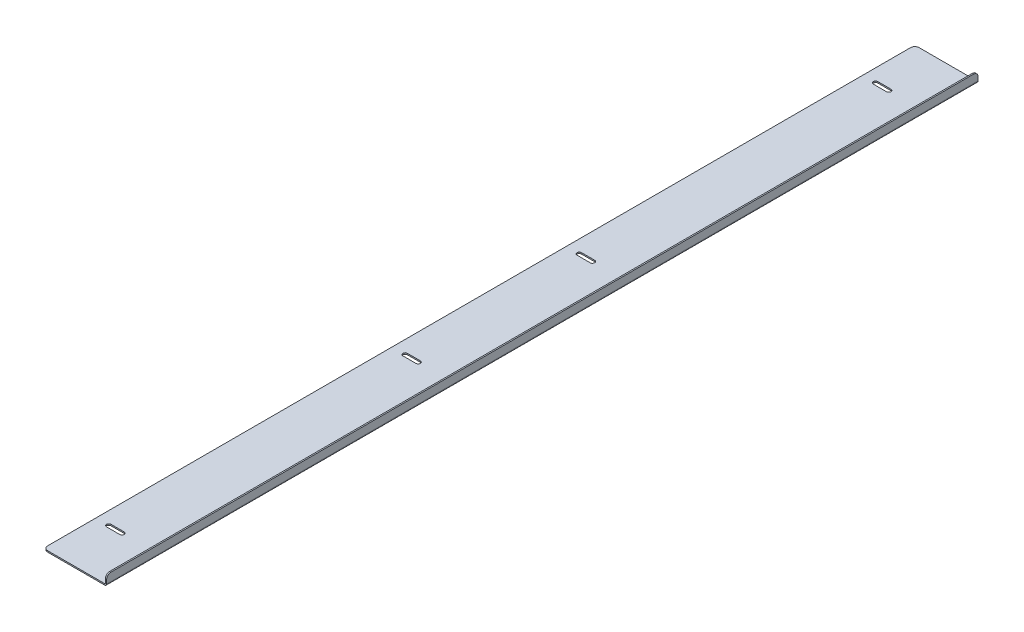
ISO-10303-21;
HEADER;
FILE_DESCRIPTION(('STEP AP214'),'2;1');
FILE_NAME('part.step','',(''),(''),'','','');
FILE_SCHEMA(('AUTOMOTIVE_DESIGN { 1 0 10303 214 1 1 1 1 }'));
ENDSEC;
DATA;
#1=APPLICATION_CONTEXT('core data for automotive mechanical design processes');
#2=APPLICATION_PROTOCOL_DEFINITION('international standard','automotive_design',2000,#1);
#3=PRODUCT_CONTEXT('',#1,'mechanical');
#4=PRODUCT('Part','Part','',(#3));
#5=PRODUCT_RELATED_PRODUCT_CATEGORY('part','',(#4));
#6=PRODUCT_DEFINITION_FORMATION('','',#4);
#7=PRODUCT_DEFINITION_CONTEXT('part definition',#1,'design');
#8=PRODUCT_DEFINITION('design','',#6,#7);
#9=PRODUCT_DEFINITION_SHAPE('','',#8);
#10=(LENGTH_UNIT() NAMED_UNIT(*) SI_UNIT(.MILLI.,.METRE.));
#11=(NAMED_UNIT(*) PLANE_ANGLE_UNIT() SI_UNIT($,.RADIAN.));
#12=(NAMED_UNIT(*) SI_UNIT($,.STERADIAN.) SOLID_ANGLE_UNIT());
#13=UNCERTAINTY_MEASURE_WITH_UNIT(LENGTH_MEASURE(1.E-05),#10,'distance_accuracy_value','');
#14=(GEOMETRIC_REPRESENTATION_CONTEXT(3) GLOBAL_UNCERTAINTY_ASSIGNED_CONTEXT((#13)) GLOBAL_UNIT_ASSIGNED_CONTEXT((#10,
#11,#12)) REPRESENTATION_CONTEXT('',''));
#15=CARTESIAN_POINT('',(0.,0.,0.));
#16=DIRECTION('',(0.,0.,1.));
#17=DIRECTION('',(1.,0.,0.));
#18=AXIS2_PLACEMENT_3D('',#15,#16,#17);
#19=CARTESIAN_POINT('',(-35.5,-5.,1000.));
#20=DIRECTION('',(0.,1.,0.));
#21=DIRECTION('',(0.,0.,1.));
#22=AXIS2_PLACEMENT_3D('',#19,#20,#21);
#23=PLANE('',#22);
#24=DIRECTION('',(1.,0.,0.));
#25=VECTOR('',#24,1.);
#26=CARTESIAN_POINT('',(0.,-5.,937.45));
#27=LINE('',#26,#25);
#28=CARTESIAN_POINT('',(-20.4999999999997,-5.,937.45));
#29=VERTEX_POINT('',#28);
#30=CARTESIAN_POINT('',(-5.49999999999965,-5.,937.45));
#31=VERTEX_POINT('',#30);
#32=EDGE_CURVE('E279',#29,#31,#27,.T.);
#33=ORIENTED_EDGE('',*,*,#32,.T.);
#34=CARTESIAN_POINT('',(-5.49999999999965,-5.,940.));
#35=DIRECTION('',(0.,1.,0.));
#36=DIRECTION('',(0.,0.,1.));
#37=AXIS2_PLACEMENT_3D('',#34,#35,#36);
#38=CIRCLE('',#37,2.55000000000005);
#39=CARTESIAN_POINT('',(-5.49999999999965,-5.,942.55));
#40=VERTEX_POINT('',#39);
#41=EDGE_CURVE('E261',#31,#40,#38,.F.);
#42=ORIENTED_EDGE('',*,*,#41,.T.);
#43=DIRECTION('',(1.,0.,0.));
#44=VECTOR('',#43,1.);
#45=CARTESIAN_POINT('',(0.,-5.,942.55));
#46=LINE('',#45,#44);
#47=CARTESIAN_POINT('',(-20.4999999999997,-5.,942.55));
#48=VERTEX_POINT('',#47);
#49=EDGE_CURVE('E268',#48,#40,#46,.T.);
#50=ORIENTED_EDGE('',*,*,#49,.F.);
#51=CARTESIAN_POINT('',(-20.4999999999997,-5.,940.));
#52=DIRECTION('',(0.,1.,0.));
#53=DIRECTION('',(0.,0.,1.));
#54=AXIS2_PLACEMENT_3D('',#51,#52,#53);
#55=CIRCLE('',#54,2.55000000000005);
#56=EDGE_CURVE('E282',#29,#48,#55,.T.);
#57=ORIENTED_EDGE('',*,*,#56,.F.);
#58=EDGE_LOOP('',(#33,#42,#50,#57));
#59=FACE_BOUND('',#58,.T.);
#60=DIRECTION('',(1.,0.,0.));
#61=VECTOR('',#60,1.);
#62=CARTESIAN_POINT('',(0.,-5.,62.5500000000001));
#63=LINE('',#62,#61);
#64=CARTESIAN_POINT('',(-20.4999999999998,-5.,62.5500000000001));
#65=VERTEX_POINT('',#64);
#66=CARTESIAN_POINT('',(-5.49999999999977,-5.,62.5500000000001));
#67=VERTEX_POINT('',#66);
#68=EDGE_CURVE('E342',#65,#67,#63,.T.);
#69=ORIENTED_EDGE('',*,*,#68,.F.);
#70=CARTESIAN_POINT('',(-20.4999999999998,-5.,60.0000000000001));
#71=DIRECTION('',(0.,1.,0.));
#72=DIRECTION('',(0.,0.,1.));
#73=AXIS2_PLACEMENT_3D('',#70,#71,#72);
#74=CIRCLE('',#73,2.55000000000005);
#75=CARTESIAN_POINT('',(-20.4999999999998,-5.,57.45));
#76=VERTEX_POINT('',#75);
#77=EDGE_CURVE('E321',#65,#76,#74,.F.);
#78=ORIENTED_EDGE('',*,*,#77,.T.);
#79=DIRECTION('',(1.,0.,0.));
#80=VECTOR('',#79,1.);
#81=CARTESIAN_POINT('',(0.,-5.,57.45));
#82=LINE('',#81,#80);
#83=CARTESIAN_POINT('',(-5.49999999999977,-5.,57.45));
#84=VERTEX_POINT('',#83);
#85=EDGE_CURVE('E331',#76,#84,#82,.T.);
#86=ORIENTED_EDGE('',*,*,#85,.T.);
#87=CARTESIAN_POINT('',(-5.49999999999977,-5.,60.0000000000001));
#88=DIRECTION('',(0.,1.,0.));
#89=DIRECTION('',(0.,0.,1.));
#90=AXIS2_PLACEMENT_3D('',#87,#88,#89);
#91=CIRCLE('',#90,2.55000000000005);
#92=EDGE_CURVE('E345',#67,#84,#91,.T.);
#93=ORIENTED_EDGE('',*,*,#92,.F.);
#94=EDGE_LOOP('',(#69,#78,#86,#93));
#95=FACE_BOUND('',#94,.T.);
#96=DIRECTION('',(0.,0.,-1.));
#97=VECTOR('',#96,1.);
#98=CARTESIAN_POINT('',(-35.5,-5.,1000.));
#99=LINE('',#98,#97);
#100=CARTESIAN_POINT('',(-35.5,-5.,995.));
#101=VERTEX_POINT('',#100);
#102=CARTESIAN_POINT('',(-35.5,-5.,5.));
#103=VERTEX_POINT('',#102);
#104=EDGE_CURVE('E399',#101,#103,#99,.T.);
#105=ORIENTED_EDGE('',*,*,#104,.F.);
#106=CARTESIAN_POINT('',(-30.5,-5.,995.));
#107=DIRECTION('',(0.,1.,0.));
#108=DIRECTION('',(0.,0.,1.));
#109=AXIS2_PLACEMENT_3D('',#106,#107,#108);
#110=CIRCLE('',#109,5.);
#111=CARTESIAN_POINT('',(-30.5,-5.,1000.));
#112=VERTEX_POINT('',#111);
#113=EDGE_CURVE('E446',#101,#112,#110,.T.);
#114=ORIENTED_EDGE('',*,*,#113,.T.);
#115=DIRECTION('',(1.,0.,0.));
#116=VECTOR('',#115,1.);
#117=CARTESIAN_POINT('',(-35.5,-5.,1000.));
#118=LINE('',#117,#116);
#119=CARTESIAN_POINT('',(34.7634,-5.,1000.));
#120=VERTEX_POINT('',#119);
#121=EDGE_CURVE('E370',#112,#120,#118,.T.);
#122=ORIENTED_EDGE('',*,*,#121,.T.);
#123=DIRECTION('',(0.,0.,-1.));
#124=VECTOR('',#123,1.);
#125=CARTESIAN_POINT('',(34.7634,-5.,1000.));
#126=LINE('',#125,#124);
#127=CARTESIAN_POINT('',(34.7634,-5.,0.));
#128=VERTEX_POINT('',#127);
#129=EDGE_CURVE('E402',#120,#128,#126,.T.);
#130=ORIENTED_EDGE('',*,*,#129,.T.);
#131=DIRECTION('',(1.,0.,0.));
#132=VECTOR('',#131,1.);
#133=CARTESIAN_POINT('',(-35.5,-5.,0.));
#134=LINE('',#133,#132);
#135=CARTESIAN_POINT('',(-30.5,-5.,0.));
#136=VERTEX_POINT('',#135);
#137=EDGE_CURVE('E386',#136,#128,#134,.T.);
#138=ORIENTED_EDGE('',*,*,#137,.F.);
#139=CARTESIAN_POINT('',(-30.5,-5.,5.));
#140=DIRECTION('',(0.,1.,0.));
#141=DIRECTION('',(0.,0.,1.));
#142=AXIS2_PLACEMENT_3D('',#139,#140,#141);
#143=CIRCLE('',#142,5.);
#144=EDGE_CURVE('E444',#136,#103,#143,.T.);
#145=ORIENTED_EDGE('',*,*,#144,.T.);
#146=EDGE_LOOP('',(#105,#114,#122,#130,#138,#145));
#147=FACE_BOUND('',#146,.T.);
#148=DIRECTION('',(1.,0.,0.));
#149=VECTOR('',#148,1.);
#150=CARTESIAN_POINT('',(0.,-5.,602.55));
#151=LINE('',#150,#149);
#152=CARTESIAN_POINT('',(-20.4999999999998,-5.,602.55));
#153=VERTEX_POINT('',#152);
#154=CARTESIAN_POINT('',(-5.49999999999978,-5.,602.55));
#155=VERTEX_POINT('',#154);
#156=EDGE_CURVE('E310',#153,#155,#151,.T.);
#157=ORIENTED_EDGE('',*,*,#156,.F.);
#158=CARTESIAN_POINT('',(-20.4999999999998,-5.,600.));
#159=DIRECTION('',(0.,1.,0.));
#160=DIRECTION('',(0.,0.,1.));
#161=AXIS2_PLACEMENT_3D('',#158,#159,#160);
#162=CIRCLE('',#161,2.54999999999983);
#163=CARTESIAN_POINT('',(-20.4999999999998,-5.,597.450000000001));
#164=VERTEX_POINT('',#163);
#165=EDGE_CURVE('E289',#153,#164,#162,.F.);
#166=ORIENTED_EDGE('',*,*,#165,.T.);
#167=DIRECTION('',(1.,0.,0.));
#168=VECTOR('',#167,1.);
#169=CARTESIAN_POINT('',(0.,-5.,597.450000000001));
#170=LINE('',#169,#168);
#171=CARTESIAN_POINT('',(-5.49999999999978,-5.,597.450000000001));
#172=VERTEX_POINT('',#171);
#173=EDGE_CURVE('E299',#164,#172,#170,.T.);
#174=ORIENTED_EDGE('',*,*,#173,.T.);
#175=CARTESIAN_POINT('',(-5.49999999999978,-5.,600.));
#176=DIRECTION('',(0.,1.,0.));
#177=DIRECTION('',(0.,0.,1.));
#178=AXIS2_PLACEMENT_3D('',#175,#176,#177);
#179=CIRCLE('',#178,2.54999999999983);
#180=EDGE_CURVE('E313',#155,#172,#179,.T.);
#181=ORIENTED_EDGE('',*,*,#180,.F.);
#182=EDGE_LOOP('',(#157,#166,#174,#181));
#183=FACE_BOUND('',#182,.T.);
#184=DIRECTION('',(1.,0.,0.));
#185=VECTOR('',#184,1.);
#186=CARTESIAN_POINT('',(0.,-5.,397.45));
#187=LINE('',#186,#185);
#188=CARTESIAN_POINT('',(-20.4999999999997,-5.,397.45));
#189=VERTEX_POINT('',#188);
#190=CARTESIAN_POINT('',(-5.49999999999967,-5.,397.45));
#191=VERTEX_POINT('',#190);
#192=EDGE_CURVE('E255',#189,#191,#187,.T.);
#193=ORIENTED_EDGE('',*,*,#192,.T.);
#194=CARTESIAN_POINT('',(-5.49999999999966,-5.,400.));
#195=DIRECTION('',(0.,1.,0.));
#196=DIRECTION('',(0.,0.,1.));
#197=AXIS2_PLACEMENT_3D('',#194,#195,#196);
#198=CIRCLE('',#197,2.54999999999994);
#199=CARTESIAN_POINT('',(-5.49999999999966,-5.,402.55));
#200=VERTEX_POINT('',#199);
#201=EDGE_CURVE('E240',#191,#200,#198,.F.);
#202=ORIENTED_EDGE('',*,*,#201,.T.);
#203=DIRECTION('',(1.,0.,0.));
#204=VECTOR('',#203,1.);
#205=CARTESIAN_POINT('',(0.,-5.,402.55));
#206=LINE('',#205,#204);
#207=CARTESIAN_POINT('',(-20.4999999999997,-5.,402.55));
#208=VERTEX_POINT('',#207);
#209=EDGE_CURVE('E246',#208,#200,#206,.T.);
#210=ORIENTED_EDGE('',*,*,#209,.F.);
#211=CARTESIAN_POINT('',(-20.4999999999997,-5.,400.));
#212=DIRECTION('',(0.,1.,0.));
#213=DIRECTION('',(0.,0.,1.));
#214=AXIS2_PLACEMENT_3D('',#211,#212,#213);
#215=CIRCLE('',#214,2.54999999999994);
#216=EDGE_CURVE('E249',#189,#208,#215,.T.);
#217=ORIENTED_EDGE('',*,*,#216,.F.);
#218=EDGE_LOOP('',(#193,#202,#210,#217));
#219=FACE_BOUND('',#218,.T.);
#220=ADVANCED_FACE('F35',(#59,#95,#147,#183,#219),#23,.T.);
#221=CARTESIAN_POINT('',(-35.5,-6.5,1000.));
#222=DIRECTION('',(0.,1.,0.));
#223=DIRECTION('',(0.,0.,1.));
#224=AXIS2_PLACEMENT_3D('',#221,#222,#223);
#225=PLANE('',#224);
#226=CARTESIAN_POINT('',(-5.49999999999965,-6.5,940.));
#227=DIRECTION('',(0.,1.,0.));
#228=DIRECTION('',(0.,0.,1.));
#229=AXIS2_PLACEMENT_3D('',#226,#227,#228);
#230=CIRCLE('',#229,2.55000000000005);
#231=CARTESIAN_POINT('',(-5.49999999999965,-6.5,937.45));
#232=VERTEX_POINT('',#231);
#233=CARTESIAN_POINT('',(-5.49999999999965,-6.5,942.55));
#234=VERTEX_POINT('',#233);
#235=EDGE_CURVE('E265',#232,#234,#230,.F.);
#236=ORIENTED_EDGE('',*,*,#235,.F.);
#237=DIRECTION('',(1.,0.,0.));
#238=VECTOR('',#237,1.);
#239=CARTESIAN_POINT('',(0.,-6.5,937.45));
#240=LINE('',#239,#238);
#241=CARTESIAN_POINT('',(-20.4999999999997,-6.5,937.45));
#242=VERTEX_POINT('',#241);
#243=EDGE_CURVE('E267',#242,#232,#240,.T.);
#244=ORIENTED_EDGE('',*,*,#243,.F.);
#245=CARTESIAN_POINT('',(-20.4999999999997,-6.5,940.));
#246=DIRECTION('',(0.,1.,0.));
#247=DIRECTION('',(0.,0.,1.));
#248=AXIS2_PLACEMENT_3D('',#245,#246,#247);
#249=CIRCLE('',#248,2.55000000000005);
#250=CARTESIAN_POINT('',(-20.4999999999997,-6.5,942.55));
#251=VERTEX_POINT('',#250);
#252=EDGE_CURVE('E270',#242,#251,#249,.T.);
#253=ORIENTED_EDGE('',*,*,#252,.T.);
#254=DIRECTION('',(1.,0.,0.));
#255=VECTOR('',#254,1.);
#256=CARTESIAN_POINT('',(0.,-6.5,942.55));
#257=LINE('',#256,#255);
#258=EDGE_CURVE('E273',#251,#234,#257,.T.);
#259=ORIENTED_EDGE('',*,*,#258,.T.);
#260=EDGE_LOOP('',(#236,#244,#253,#259));
#261=FACE_BOUND('',#260,.T.);
#262=CARTESIAN_POINT('',(-20.4999999999998,-6.5,60.0000000000001));
#263=DIRECTION('',(0.,1.,0.));
#264=DIRECTION('',(0.,0.,1.));
#265=AXIS2_PLACEMENT_3D('',#262,#263,#264);
#266=CIRCLE('',#265,2.55000000000005);
#267=CARTESIAN_POINT('',(-20.4999999999998,-6.5,62.5500000000001));
#268=VERTEX_POINT('',#267);
#269=CARTESIAN_POINT('',(-20.4999999999998,-6.5,57.45));
#270=VERTEX_POINT('',#269);
#271=EDGE_CURVE('E328',#268,#270,#266,.F.);
#272=ORIENTED_EDGE('',*,*,#271,.F.);
#273=DIRECTION('',(1.,0.,0.));
#274=VECTOR('',#273,1.);
#275=CARTESIAN_POINT('',(0.,-6.5,62.5500000000001));
#276=LINE('',#275,#274);
#277=CARTESIAN_POINT('',(-5.49999999999978,-6.5,62.5500000000001));
#278=VERTEX_POINT('',#277);
#279=EDGE_CURVE('E330',#268,#278,#276,.T.);
#280=ORIENTED_EDGE('',*,*,#279,.T.);
#281=CARTESIAN_POINT('',(-5.49999999999977,-6.5,60.0000000000001));
#282=DIRECTION('',(0.,1.,0.));
#283=DIRECTION('',(0.,0.,1.));
#284=AXIS2_PLACEMENT_3D('',#281,#282,#283);
#285=CIRCLE('',#284,2.55000000000005);
#286=CARTESIAN_POINT('',(-5.49999999999977,-6.5,57.45));
#287=VERTEX_POINT('',#286);
#288=EDGE_CURVE('E334',#278,#287,#285,.T.);
#289=ORIENTED_EDGE('',*,*,#288,.T.);
#290=DIRECTION('',(1.,0.,0.));
#291=VECTOR('',#290,1.);
#292=CARTESIAN_POINT('',(0.,-6.5,57.45));
#293=LINE('',#292,#291);
#294=EDGE_CURVE('E337',#270,#287,#293,.T.);
#295=ORIENTED_EDGE('',*,*,#294,.F.);
#296=EDGE_LOOP('',(#272,#280,#289,#295));
#297=FACE_BOUND('',#296,.T.);
#298=DIRECTION('',(1.,0.,0.));
#299=VECTOR('',#298,1.);
#300=CARTESIAN_POINT('',(-35.5,-6.5,1000.));
#301=LINE('',#300,#299);
#302=CARTESIAN_POINT('',(-30.5,-6.5,1000.));
#303=VERTEX_POINT('',#302);
#304=CARTESIAN_POINT('',(34.7634,-6.5,1000.));
#305=VERTEX_POINT('',#304);
#306=EDGE_CURVE('E372',#303,#305,#301,.T.);
#307=ORIENTED_EDGE('',*,*,#306,.F.);
#308=CARTESIAN_POINT('',(-30.5,-6.5,995.));
#309=DIRECTION('',(0.,1.,0.));
#310=DIRECTION('',(0.,0.,1.));
#311=AXIS2_PLACEMENT_3D('',#308,#309,#310);
#312=CIRCLE('',#311,5.);
#313=CARTESIAN_POINT('',(-35.5,-6.5,995.));
#314=VERTEX_POINT('',#313);
#315=EDGE_CURVE('E450',#303,#314,#312,.F.);
#316=ORIENTED_EDGE('',*,*,#315,.T.);
#317=DIRECTION('',(0.,0.,-1.));
#318=VECTOR('',#317,1.);
#319=CARTESIAN_POINT('',(-35.5,-6.5,1000.));
#320=LINE('',#319,#318);
#321=CARTESIAN_POINT('',(-35.5,-6.5,5.));
#322=VERTEX_POINT('',#321);
#323=EDGE_CURVE('E397',#314,#322,#320,.T.);
#324=ORIENTED_EDGE('',*,*,#323,.T.);
#325=CARTESIAN_POINT('',(-30.5,-6.5,5.));
#326=DIRECTION('',(0.,1.,0.));
#327=DIRECTION('',(0.,0.,1.));
#328=AXIS2_PLACEMENT_3D('',#325,#326,#327);
#329=CIRCLE('',#328,5.);
#330=CARTESIAN_POINT('',(-30.5,-6.5,0.));
#331=VERTEX_POINT('',#330);
#332=EDGE_CURVE('E50',#322,#331,#329,.F.);
#333=ORIENTED_EDGE('',*,*,#332,.T.);
#334=DIRECTION('',(1.,0.,0.));
#335=VECTOR('',#334,1.);
#336=CARTESIAN_POINT('',(-35.5,-6.5,0.));
#337=LINE('',#336,#335);
#338=CARTESIAN_POINT('',(34.7634,-6.5,0.));
#339=VERTEX_POINT('',#338);
#340=EDGE_CURVE('E388',#331,#339,#337,.T.);
#341=ORIENTED_EDGE('',*,*,#340,.T.);
#342=DIRECTION('',(0.,0.,-1.));
#343=VECTOR('',#342,1.);
#344=CARTESIAN_POINT('',(34.7634,-6.5,1000.));
#345=LINE('',#344,#343);
#346=EDGE_CURVE('E394',#305,#339,#345,.T.);
#347=ORIENTED_EDGE('',*,*,#346,.F.);
#348=EDGE_LOOP('',(#307,#316,#324,#333,#341,#347));
#349=FACE_BOUND('',#348,.T.);
#350=CARTESIAN_POINT('',(-20.4999999999998,-6.5,600.));
#351=DIRECTION('',(0.,1.,0.));
#352=DIRECTION('',(0.,0.,1.));
#353=AXIS2_PLACEMENT_3D('',#350,#351,#352);
#354=CIRCLE('',#353,2.54999999999983);
#355=CARTESIAN_POINT('',(-20.4999999999998,-6.5,602.55));
#356=VERTEX_POINT('',#355);
#357=CARTESIAN_POINT('',(-20.4999999999998,-6.5,597.450000000001));
#358=VERTEX_POINT('',#357);
#359=EDGE_CURVE('E296',#356,#358,#354,.F.);
#360=ORIENTED_EDGE('',*,*,#359,.F.);
#361=DIRECTION('',(1.,0.,0.));
#362=VECTOR('',#361,1.);
#363=CARTESIAN_POINT('',(0.,-6.5,602.55));
#364=LINE('',#363,#362);
#365=CARTESIAN_POINT('',(-5.49999999999978,-6.5,602.55));
#366=VERTEX_POINT('',#365);
#367=EDGE_CURVE('E298',#356,#366,#364,.T.);
#368=ORIENTED_EDGE('',*,*,#367,.T.);
#369=CARTESIAN_POINT('',(-5.49999999999978,-6.5,600.));
#370=DIRECTION('',(0.,1.,0.));
#371=DIRECTION('',(0.,0.,1.));
#372=AXIS2_PLACEMENT_3D('',#369,#370,#371);
#373=CIRCLE('',#372,2.54999999999983);
#374=CARTESIAN_POINT('',(-5.49999999999978,-6.5,597.450000000001));
#375=VERTEX_POINT('',#374);
#376=EDGE_CURVE('E302',#366,#375,#373,.T.);
#377=ORIENTED_EDGE('',*,*,#376,.T.);
#378=DIRECTION('',(1.,0.,0.));
#379=VECTOR('',#378,1.);
#380=CARTESIAN_POINT('',(0.,-6.5,597.450000000001));
#381=LINE('',#380,#379);
#382=EDGE_CURVE('E305',#358,#375,#381,.T.);
#383=ORIENTED_EDGE('',*,*,#382,.F.);
#384=EDGE_LOOP('',(#360,#368,#377,#383));
#385=FACE_BOUND('',#384,.T.);
#386=CARTESIAN_POINT('',(-5.49999999999966,-6.5,400.));
#387=DIRECTION('',(0.,1.,0.));
#388=DIRECTION('',(0.,0.,1.));
#389=AXIS2_PLACEMENT_3D('',#386,#387,#388);
#390=CIRCLE('',#389,2.54999999999994);
#391=CARTESIAN_POINT('',(-5.49999999999966,-6.5,397.45));
#392=VERTEX_POINT('',#391);
#393=CARTESIAN_POINT('',(-5.49999999999966,-6.5,402.55));
#394=VERTEX_POINT('',#393);
#395=EDGE_CURVE('E234',#392,#394,#390,.F.);
#396=ORIENTED_EDGE('',*,*,#395,.F.);
#397=DIRECTION('',(1.,0.,0.));
#398=VECTOR('',#397,1.);
#399=CARTESIAN_POINT('',(0.,-6.5,397.45));
#400=LINE('',#399,#398);
#401=CARTESIAN_POINT('',(-20.4999999999997,-6.5,397.45));
#402=VERTEX_POINT('',#401);
#403=EDGE_CURVE('E223',#402,#392,#400,.T.);
#404=ORIENTED_EDGE('',*,*,#403,.F.);
#405=CARTESIAN_POINT('',(-20.4999999999997,-6.5,400.));
#406=DIRECTION('',(0.,1.,0.));
#407=DIRECTION('',(0.,0.,1.));
#408=AXIS2_PLACEMENT_3D('',#405,#406,#407);
#409=CIRCLE('',#408,2.54999999999994);
#410=CARTESIAN_POINT('',(-20.4999999999997,-6.5,402.55));
#411=VERTEX_POINT('',#410);
#412=EDGE_CURVE('E233',#402,#411,#409,.T.);
#413=ORIENTED_EDGE('',*,*,#412,.T.);
#414=DIRECTION('',(1.,0.,0.));
#415=VECTOR('',#414,1.);
#416=CARTESIAN_POINT('',(0.,-6.5,402.55));
#417=LINE('',#416,#415);
#418=EDGE_CURVE('E241',#411,#394,#417,.T.);
#419=ORIENTED_EDGE('',*,*,#418,.T.);
#420=EDGE_LOOP('',(#396,#404,#413,#419));
#421=FACE_BOUND('',#420,.T.);
#422=ADVANCED_FACE('F244',(#261,#297,#349,#385,#421),#225,.F.);
#423=CARTESIAN_POINT('',(35.5,-4.2634,1000.));
#424=DIRECTION('',(0.,0.,1.));
#425=DIRECTION('',(1.,0.,0.));
#426=AXIS2_PLACEMENT_3D('',#423,#424,#425);
#427=PLANE('',#426);
#428=DIRECTION('',(1.,0.,0.));
#429=VECTOR('',#428,1.);
#430=CARTESIAN_POINT('',(35.5,-4.2634,1000.));
#431=LINE('',#430,#429);
#432=CARTESIAN_POINT('',(35.5,-4.2634,1000.));
#433=VERTEX_POINT('',#432);
#434=CARTESIAN_POINT('',(37.,-4.2634,1000.));
#435=VERTEX_POINT('',#434);
#436=EDGE_CURVE('E422',#433,#435,#431,.T.);
#437=ORIENTED_EDGE('',*,*,#436,.F.);
#438=CARTESIAN_POINT('',(34.7634,-4.2634,1000.));
#439=DIRECTION('',(0.,0.,1.));
#440=DIRECTION('',(1.,0.,0.));
#441=AXIS2_PLACEMENT_3D('',#438,#439,#440);
#442=CIRCLE('',#441,0.7366);
#443=EDGE_CURVE('E367',#120,#433,#442,.T.);
#444=ORIENTED_EDGE('',*,*,#443,.F.);
#445=DIRECTION('',(0.,1.,0.));
#446=VECTOR('',#445,1.);
#447=CARTESIAN_POINT('',(34.7634,-6.5,1000.));
#448=LINE('',#447,#446);
#449=EDGE_CURVE('E419',#305,#120,#448,.T.);
#450=ORIENTED_EDGE('',*,*,#449,.F.);
#451=CARTESIAN_POINT('',(34.7634,-4.2634,1000.));
#452=DIRECTION('',(0.,0.,1.));
#453=DIRECTION('',(1.,0.,0.));
#454=AXIS2_PLACEMENT_3D('',#451,#452,#453);
#455=CIRCLE('',#454,2.2366);
#456=EDGE_CURVE('E374',#305,#435,#455,.T.);
#457=ORIENTED_EDGE('',*,*,#456,.T.);
#458=EDGE_LOOP('',(#437,#444,#450,#457));
#459=FACE_BOUND('',#458,.T.);
#460=ADVANCED_FACE('F511',(#459),#427,.T.);
#461=CARTESIAN_POINT('',(34.7634,-6.5,1000.));
#462=DIRECTION('',(0.,0.,1.));
#463=DIRECTION('',(1.,0.,0.));
#464=AXIS2_PLACEMENT_3D('',#461,#462,#463);
#465=PLANE('',#464);
#466=DIRECTION('',(0.,1.,0.));
#467=VECTOR('',#466,1.);
#468=CARTESIAN_POINT('',(37.,-5.,1000.));
#469=LINE('',#468,#467);
#470=CARTESIAN_POINT('',(37.,0.,1000.));
#471=VERTEX_POINT('',#470);
#472=EDGE_CURVE('E360',#435,#471,#469,.T.);
#473=ORIENTED_EDGE('',*,*,#472,.T.);
#474=DIRECTION('',(1.,0.,0.));
#475=VECTOR('',#474,1.);
#476=CARTESIAN_POINT('',(34.7634,0.,1000.));
#477=LINE('',#476,#475);
#478=CARTESIAN_POINT('',(35.5,0.,1000.));
#479=VERTEX_POINT('',#478);
#480=EDGE_CURVE('E433',#471,#479,#477,.F.);
#481=ORIENTED_EDGE('',*,*,#480,.T.);
#482=DIRECTION('',(0.,1.,0.));
#483=VECTOR('',#482,1.);
#484=CARTESIAN_POINT('',(35.5,-5.,1000.));
#485=LINE('',#484,#483);
#486=EDGE_CURVE('E363',#433,#479,#485,.T.);
#487=ORIENTED_EDGE('',*,*,#486,.F.);
#488=ORIENTED_EDGE('',*,*,#436,.T.);
#489=EDGE_LOOP('',(#473,#481,#487,#488));
#490=FACE_BOUND('',#489,.T.);
#491=ADVANCED_FACE('F490',(#490),#465,.T.);
#492=CARTESIAN_POINT('',(34.7634,-5.,0.));
#493=DIRECTION('',(0.,0.,-1.));
#494=DIRECTION('',(-1.,0.,0.));
#495=AXIS2_PLACEMENT_3D('',#492,#493,#494);
#496=PLANE('',#495);
#497=DIRECTION('',(0.,-1.,0.));
#498=VECTOR('',#497,1.);
#499=CARTESIAN_POINT('',(34.7634,-5.,0.));
#500=LINE('',#499,#498);
#501=EDGE_CURVE('E416',#128,#339,#500,.T.);
#502=ORIENTED_EDGE('',*,*,#501,.F.);
#503=CARTESIAN_POINT('',(34.7634,-4.2634,0.));
#504=DIRECTION('',(0.,0.,1.));
#505=DIRECTION('',(1.,0.,0.));
#506=AXIS2_PLACEMENT_3D('',#503,#504,#505);
#507=CIRCLE('',#506,0.7366);
#508=CARTESIAN_POINT('',(35.5,-4.2634,0.));
#509=VERTEX_POINT('',#508);
#510=EDGE_CURVE('E383',#128,#509,#507,.T.);
#511=ORIENTED_EDGE('',*,*,#510,.T.);
#512=DIRECTION('',(-1.,0.,0.));
#513=VECTOR('',#512,1.);
#514=CARTESIAN_POINT('',(37.,-4.2634,0.));
#515=LINE('',#514,#513);
#516=CARTESIAN_POINT('',(37.,-4.2634,0.));
#517=VERTEX_POINT('',#516);
#518=EDGE_CURVE('E414',#517,#509,#515,.T.);
#519=ORIENTED_EDGE('',*,*,#518,.F.);
#520=CARTESIAN_POINT('',(34.7634,-4.2634,0.));
#521=DIRECTION('',(0.,0.,1.));
#522=DIRECTION('',(1.,0.,0.));
#523=AXIS2_PLACEMENT_3D('',#520,#521,#522);
#524=CIRCLE('',#523,2.2366);
#525=EDGE_CURVE('E364',#339,#517,#524,.T.);
#526=ORIENTED_EDGE('',*,*,#525,.F.);
#527=EDGE_LOOP('',(#502,#511,#519,#526));
#528=FACE_BOUND('',#527,.T.);
#529=ADVANCED_FACE('F471',(#528),#496,.T.);
#530=CARTESIAN_POINT('',(37.,-4.2634,0.));
#531=DIRECTION('',(0.,0.,-1.));
#532=DIRECTION('',(-1.,0.,0.));
#533=AXIS2_PLACEMENT_3D('',#530,#531,#532);
#534=PLANE('',#533);
#535=ORIENTED_EDGE('',*,*,#340,.F.);
#536=DIRECTION('',(0.,1.,0.));
#537=VECTOR('',#536,1.);
#538=CARTESIAN_POINT('',(-30.5,-4.2634,0.));
#539=LINE('',#538,#537);
#540=EDGE_CURVE('E11',#331,#136,#539,.T.);
#541=ORIENTED_EDGE('',*,*,#540,.T.);
#542=ORIENTED_EDGE('',*,*,#137,.T.);
#543=ORIENTED_EDGE('',*,*,#501,.T.);
#544=EDGE_LOOP('',(#535,#541,#542,#543));
#545=FACE_BOUND('',#544,.T.);
#546=ADVANCED_FACE('F526',(#545),#534,.T.);
#547=CARTESIAN_POINT('',(37.,-5.,1000.));
#548=DIRECTION('',(-1.,0.,0.));
#549=DIRECTION('',(0.,0.,1.));
#550=AXIS2_PLACEMENT_3D('',#547,#548,#549);
#551=PLANE('',#550);
#552=DIRECTION('',(0.,0.,-1.));
#553=VECTOR('',#552,1.);
#554=CARTESIAN_POINT('',(37.,5.,1000.));
#555=LINE('',#554,#553);
#556=CARTESIAN_POINT('',(37.,5.,995.));
#557=VERTEX_POINT('',#556);
#558=CARTESIAN_POINT('',(37.,5.,5.));
#559=VERTEX_POINT('',#558);
#560=EDGE_CURVE('E411',#557,#559,#555,.T.);
#561=ORIENTED_EDGE('',*,*,#560,.F.);
#562=CARTESIAN_POINT('',(37.,0.,995.));
#563=DIRECTION('',(-1.,0.,0.));
#564=DIRECTION('',(0.,0.,1.));
#565=AXIS2_PLACEMENT_3D('',#562,#563,#564);
#566=CIRCLE('',#565,5.);
#567=EDGE_CURVE('E431',#557,#471,#566,.F.);
#568=ORIENTED_EDGE('',*,*,#567,.T.);
#569=ORIENTED_EDGE('',*,*,#472,.F.);
#570=DIRECTION('',(0.,0.,-1.));
#571=VECTOR('',#570,1.);
#572=CARTESIAN_POINT('',(37.,-4.2634,1000.));
#573=LINE('',#572,#571);
#574=EDGE_CURVE('E377',#435,#517,#573,.T.);
#575=ORIENTED_EDGE('',*,*,#574,.T.);
#576=DIRECTION('',(0.,1.,0.));
#577=VECTOR('',#576,1.);
#578=CARTESIAN_POINT('',(37.,-5.,0.));
#579=LINE('',#578,#577);
#580=CARTESIAN_POINT('',(37.,0.,0.));
#581=VERTEX_POINT('',#580);
#582=EDGE_CURVE('E353',#517,#581,#579,.T.);
#583=ORIENTED_EDGE('',*,*,#582,.T.);
#584=CARTESIAN_POINT('',(37.,0.,5.));
#585=DIRECTION('',(-1.,0.,0.));
#586=DIRECTION('',(0.,0.,1.));
#587=AXIS2_PLACEMENT_3D('',#584,#585,#586);
#588=CIRCLE('',#587,5.);
#589=EDGE_CURVE('E429',#581,#559,#588,.F.);
#590=ORIENTED_EDGE('',*,*,#589,.T.);
#591=EDGE_LOOP('',(#561,#568,#569,#575,#583,#590));
#592=FACE_BOUND('',#591,.T.);
#593=ADVANCED_FACE('F461',(#592),#551,.F.);
#594=CARTESIAN_POINT('',(35.5,5.,1000.));
#595=DIRECTION('',(0.,1.,0.));
#596=DIRECTION('',(0.,0.,1.));
#597=AXIS2_PLACEMENT_3D('',#594,#595,#596);
#598=PLANE('',#597);
#599=DIRECTION('',(0.,0.,-1.));
#600=VECTOR('',#599,1.);
#601=CARTESIAN_POINT('',(35.5,5.,1000.));
#602=LINE('',#601,#600);
#603=CARTESIAN_POINT('',(35.5,5.,995.));
#604=VERTEX_POINT('',#603);
#605=CARTESIAN_POINT('',(35.5,5.,5.));
#606=VERTEX_POINT('',#605);
#607=EDGE_CURVE('E408',#604,#606,#602,.T.);
#608=ORIENTED_EDGE('',*,*,#607,.F.);
#609=DIRECTION('',(1.,0.,0.));
#610=VECTOR('',#609,1.);
#611=CARTESIAN_POINT('',(35.5,5.,995.));
#612=LINE('',#611,#610);
#613=EDGE_CURVE('E426',#604,#557,#612,.T.);
#614=ORIENTED_EDGE('',*,*,#613,.T.);
#615=ORIENTED_EDGE('',*,*,#560,.T.);
#616=DIRECTION('',(1.,0.,0.));
#617=VECTOR('',#616,1.);
#618=CARTESIAN_POINT('',(35.5,5.,5.));
#619=LINE('',#618,#617);
#620=EDGE_CURVE('E424',#559,#606,#619,.F.);
#621=ORIENTED_EDGE('',*,*,#620,.T.);
#622=EDGE_LOOP('',(#608,#614,#615,#621));
#623=FACE_BOUND('',#622,.T.);
#624=ADVANCED_FACE('F485',(#623),#598,.T.);
#625=CARTESIAN_POINT('',(35.5,-5.,1000.));
#626=DIRECTION('',(-1.,0.,0.));
#627=DIRECTION('',(0.,0.,1.));
#628=AXIS2_PLACEMENT_3D('',#625,#626,#627);
#629=PLANE('',#628);
#630=ORIENTED_EDGE('',*,*,#486,.T.);
#631=CARTESIAN_POINT('',(35.5,0.,995.));
#632=DIRECTION('',(-1.,0.,0.));
#633=DIRECTION('',(0.,0.,1.));
#634=AXIS2_PLACEMENT_3D('',#631,#632,#633);
#635=CIRCLE('',#634,5.);
#636=EDGE_CURVE('E437',#479,#604,#635,.T.);
#637=ORIENTED_EDGE('',*,*,#636,.T.);
#638=ORIENTED_EDGE('',*,*,#607,.T.);
#639=CARTESIAN_POINT('',(35.5,0.,5.));
#640=DIRECTION('',(-1.,0.,0.));
#641=DIRECTION('',(0.,0.,1.));
#642=AXIS2_PLACEMENT_3D('',#639,#640,#641);
#643=CIRCLE('',#642,5.);
#644=CARTESIAN_POINT('',(35.5,0.,0.));
#645=VERTEX_POINT('',#644);
#646=EDGE_CURVE('E435',#606,#645,#643,.T.);
#647=ORIENTED_EDGE('',*,*,#646,.T.);
#648=DIRECTION('',(0.,1.,0.));
#649=VECTOR('',#648,1.);
#650=CARTESIAN_POINT('',(35.5,-5.,0.));
#651=LINE('',#650,#649);
#652=EDGE_CURVE('E380',#509,#645,#651,.T.);
#653=ORIENTED_EDGE('',*,*,#652,.F.);
#654=DIRECTION('',(0.,0.,-1.));
#655=VECTOR('',#654,1.);
#656=CARTESIAN_POINT('',(35.5,-4.2634,1000.));
#657=LINE('',#656,#655);
#658=EDGE_CURVE('E405',#433,#509,#657,.T.);
#659=ORIENTED_EDGE('',*,*,#658,.F.);
#660=EDGE_LOOP('',(#630,#637,#638,#647,#653,#659));
#661=FACE_BOUND('',#660,.T.);
#662=ADVANCED_FACE('F480',(#661),#629,.T.);
#663=CARTESIAN_POINT('',(34.7634,-4.2634,1000.));
#664=DIRECTION('',(0.,0.,-1.));
#665=DIRECTION('',(-1.,0.,0.));
#666=AXIS2_PLACEMENT_3D('',#663,#664,#665);
#667=CYLINDRICAL_SURFACE('',#666,0.7366);
#668=ORIENTED_EDGE('',*,*,#510,.F.);
#669=ORIENTED_EDGE('',*,*,#129,.F.);
#670=ORIENTED_EDGE('',*,*,#443,.T.);
#671=ORIENTED_EDGE('',*,*,#658,.T.);
#672=EDGE_LOOP('',(#668,#669,#670,#671));
#673=FACE_BOUND('',#672,.T.);
#674=ADVANCED_FACE('F475',(#673),#667,.F.);
#675=CARTESIAN_POINT('',(-35.5,-6.5,1000.));
#676=DIRECTION('',(-1.,0.,0.));
#677=DIRECTION('',(0.,0.,1.));
#678=AXIS2_PLACEMENT_3D('',#675,#676,#677);
#679=PLANE('',#678);
#680=ORIENTED_EDGE('',*,*,#323,.F.);
#681=DIRECTION('',(0.,1.,0.));
#682=VECTOR('',#681,1.);
#683=CARTESIAN_POINT('',(-35.5,-6.5,995.));
#684=LINE('',#683,#682);
#685=EDGE_CURVE('E441',#314,#101,#684,.T.);
#686=ORIENTED_EDGE('',*,*,#685,.T.);
#687=ORIENTED_EDGE('',*,*,#104,.T.);
#688=DIRECTION('',(0.,1.,0.));
#689=VECTOR('',#688,1.);
#690=CARTESIAN_POINT('',(-35.5,-6.5,5.));
#691=LINE('',#690,#689);
#692=EDGE_CURVE('E439',#103,#322,#691,.F.);
#693=ORIENTED_EDGE('',*,*,#692,.T.);
#694=EDGE_LOOP('',(#680,#686,#687,#693));
#695=FACE_BOUND('',#694,.T.);
#696=ADVANCED_FACE('F517',(#695),#679,.T.);
#697=CARTESIAN_POINT('',(34.7634,-4.2634,1000.));
#698=DIRECTION('',(0.,0.,-1.));
#699=DIRECTION('',(-1.,0.,0.));
#700=AXIS2_PLACEMENT_3D('',#697,#698,#699);
#701=CYLINDRICAL_SURFACE('',#700,2.2366);
#702=ORIENTED_EDGE('',*,*,#525,.T.);
#703=ORIENTED_EDGE('',*,*,#574,.F.);
#704=ORIENTED_EDGE('',*,*,#456,.F.);
#705=ORIENTED_EDGE('',*,*,#346,.T.);
#706=EDGE_LOOP('',(#702,#703,#704,#705));
#707=FACE_BOUND('',#706,.T.);
#708=ADVANCED_FACE('F466',(#707),#701,.T.);
#709=CARTESIAN_POINT('',(34.7634,-4.2634,1000.));
#710=DIRECTION('',(0.,0.,1.));
#711=DIRECTION('',(1.,0.,0.));
#712=AXIS2_PLACEMENT_3D('',#709,#710,#711);
#713=PLANE('',#712);
#714=ORIENTED_EDGE('',*,*,#121,.F.);
#715=DIRECTION('',(0.,1.,0.));
#716=VECTOR('',#715,1.);
#717=CARTESIAN_POINT('',(-30.5,-4.2634,1000.));
#718=LINE('',#717,#716);
#719=EDGE_CURVE('E58',#112,#303,#718,.F.);
#720=ORIENTED_EDGE('',*,*,#719,.T.);
#721=ORIENTED_EDGE('',*,*,#306,.T.);
#722=ORIENTED_EDGE('',*,*,#449,.T.);
#723=EDGE_LOOP('',(#714,#720,#721,#722));
#724=FACE_BOUND('',#723,.T.);
#725=ADVANCED_FACE('F545',(#724),#713,.T.);
#726=CARTESIAN_POINT('',(34.7634,-4.2634,0.));
#727=DIRECTION('',(0.,0.,1.));
#728=DIRECTION('',(1.,0.,0.));
#729=AXIS2_PLACEMENT_3D('',#726,#727,#728);
#730=PLANE('',#729);
#731=ORIENTED_EDGE('',*,*,#652,.T.);
#732=DIRECTION('',(1.,0.,0.));
#733=VECTOR('',#732,1.);
#734=CARTESIAN_POINT('',(37.,0.,0.));
#735=LINE('',#734,#733);
#736=EDGE_CURVE('E43',#645,#581,#735,.T.);
#737=ORIENTED_EDGE('',*,*,#736,.T.);
#738=ORIENTED_EDGE('',*,*,#582,.F.);
#739=ORIENTED_EDGE('',*,*,#518,.T.);
#740=EDGE_LOOP('',(#731,#737,#738,#739));
#741=FACE_BOUND('',#740,.T.);
#742=ADVANCED_FACE('F455',(#741),#730,.F.);
#743=CARTESIAN_POINT('',(-20.4999999999998,-6.5,60.0000000000001));
#744=DIRECTION('',(0.,1.,0.));
#745=DIRECTION('',(0.,0.,1.));
#746=AXIS2_PLACEMENT_3D('',#743,#744,#745);
#747=CYLINDRICAL_SURFACE('',#746,2.55000000000005);
#748=ORIENTED_EDGE('',*,*,#77,.F.);
#749=DIRECTION('',(0.,1.,0.));
#750=VECTOR('',#749,1.);
#751=CARTESIAN_POINT('',(-20.4999999999998,-6.5,62.5500000000001));
#752=LINE('',#751,#750);
#753=EDGE_CURVE('E339',#268,#65,#752,.T.);
#754=ORIENTED_EDGE('',*,*,#753,.F.);
#755=ORIENTED_EDGE('',*,*,#271,.T.);
#756=DIRECTION('',(0.,1.,0.));
#757=VECTOR('',#756,1.);
#758=CARTESIAN_POINT('',(-20.4999999999998,-6.5,57.45));
#759=LINE('',#758,#757);
#760=EDGE_CURVE('E350',#270,#76,#759,.T.);
#761=ORIENTED_EDGE('',*,*,#760,.T.);
#762=EDGE_LOOP('',(#748,#754,#755,#761));
#763=FACE_BOUND('',#762,.T.);
#764=ADVANCED_FACE('F575',(#763),#747,.F.);
#765=CARTESIAN_POINT('',(0.,-6.5,57.45));
#766=DIRECTION('',(0.,0.,1.));
#767=DIRECTION('',(1.,0.,0.));
#768=AXIS2_PLACEMENT_3D('',#765,#766,#767);
#769=PLANE('',#768);
#770=ORIENTED_EDGE('',*,*,#85,.F.);
#771=ORIENTED_EDGE('',*,*,#760,.F.);
#772=ORIENTED_EDGE('',*,*,#294,.T.);
#773=DIRECTION('',(0.,1.,0.));
#774=VECTOR('',#773,1.);
#775=CARTESIAN_POINT('',(-5.49999999999977,-6.5,57.45));
#776=LINE('',#775,#774);
#777=EDGE_CURVE('E354',#287,#84,#776,.T.);
#778=ORIENTED_EDGE('',*,*,#777,.T.);
#779=EDGE_LOOP('',(#770,#771,#772,#778));
#780=FACE_BOUND('',#779,.T.);
#781=ADVANCED_FACE('F792',(#780),#769,.T.);
#782=CARTESIAN_POINT('',(-5.49999999999977,-6.5,60.0000000000001));
#783=DIRECTION('',(0.,1.,0.));
#784=DIRECTION('',(0.,0.,1.));
#785=AXIS2_PLACEMENT_3D('',#782,#783,#784);
#786=CYLINDRICAL_SURFACE('',#785,2.55000000000005);
#787=ORIENTED_EDGE('',*,*,#92,.T.);
#788=ORIENTED_EDGE('',*,*,#777,.F.);
#789=ORIENTED_EDGE('',*,*,#288,.F.);
#790=DIRECTION('',(0.,1.,0.));
#791=VECTOR('',#790,1.);
#792=CARTESIAN_POINT('',(-5.49999999999977,-6.5,62.5500000000001));
#793=LINE('',#792,#791);
#794=EDGE_CURVE('E356',#278,#67,#793,.T.);
#795=ORIENTED_EDGE('',*,*,#794,.T.);
#796=EDGE_LOOP('',(#787,#788,#789,#795));
#797=FACE_BOUND('',#796,.T.);
#798=ADVANCED_FACE('F781',(#797),#786,.F.);
#799=CARTESIAN_POINT('',(0.,-6.5,62.5500000000001));
#800=DIRECTION('',(0.,0.,1.));
#801=DIRECTION('',(1.,0.,0.));
#802=AXIS2_PLACEMENT_3D('',#799,#800,#801);
#803=PLANE('',#802);
#804=ORIENTED_EDGE('',*,*,#68,.T.);
#805=ORIENTED_EDGE('',*,*,#794,.F.);
#806=ORIENTED_EDGE('',*,*,#279,.F.);
#807=ORIENTED_EDGE('',*,*,#753,.T.);
#808=EDGE_LOOP('',(#804,#805,#806,#807));
#809=FACE_BOUND('',#808,.T.);
#810=ADVANCED_FACE('F770',(#809),#803,.F.);
#811=CARTESIAN_POINT('',(-20.4999999999998,-6.5,600.));
#812=DIRECTION('',(0.,1.,0.));
#813=DIRECTION('',(0.,0.,1.));
#814=AXIS2_PLACEMENT_3D('',#811,#812,#813);
#815=CYLINDRICAL_SURFACE('',#814,2.54999999999983);
#816=ORIENTED_EDGE('',*,*,#165,.F.);
#817=DIRECTION('',(0.,1.,0.));
#818=VECTOR('',#817,1.);
#819=CARTESIAN_POINT('',(-20.4999999999998,-6.5,602.55));
#820=LINE('',#819,#818);
#821=EDGE_CURVE('E307',#356,#153,#820,.T.);
#822=ORIENTED_EDGE('',*,*,#821,.F.);
#823=ORIENTED_EDGE('',*,*,#359,.T.);
#824=DIRECTION('',(0.,1.,0.));
#825=VECTOR('',#824,1.);
#826=CARTESIAN_POINT('',(-20.4999999999998,-6.5,597.450000000001));
#827=LINE('',#826,#825);
#828=EDGE_CURVE('E318',#358,#164,#827,.T.);
#829=ORIENTED_EDGE('',*,*,#828,.T.);
#830=EDGE_LOOP('',(#816,#822,#823,#829));
#831=FACE_BOUND('',#830,.T.);
#832=ADVANCED_FACE('F759',(#831),#815,.F.);
#833=CARTESIAN_POINT('',(0.,-6.5,597.450000000001));
#834=DIRECTION('',(0.,0.,1.));
#835=DIRECTION('',(1.,0.,0.));
#836=AXIS2_PLACEMENT_3D('',#833,#834,#835);
#837=PLANE('',#836);
#838=ORIENTED_EDGE('',*,*,#173,.F.);
#839=ORIENTED_EDGE('',*,*,#828,.F.);
#840=ORIENTED_EDGE('',*,*,#382,.T.);
#841=DIRECTION('',(0.,1.,0.));
#842=VECTOR('',#841,1.);
#843=CARTESIAN_POINT('',(-5.49999999999978,-6.5,597.450000000001));
#844=LINE('',#843,#842);
#845=EDGE_CURVE('E322',#375,#172,#844,.T.);
#846=ORIENTED_EDGE('',*,*,#845,.T.);
#847=EDGE_LOOP('',(#838,#839,#840,#846));
#848=FACE_BOUND('',#847,.T.);
#849=ADVANCED_FACE('F748',(#848),#837,.T.);
#850=CARTESIAN_POINT('',(-5.49999999999978,-6.5,600.));
#851=DIRECTION('',(0.,1.,0.));
#852=DIRECTION('',(0.,0.,1.));
#853=AXIS2_PLACEMENT_3D('',#850,#851,#852);
#854=CYLINDRICAL_SURFACE('',#853,2.54999999999983);
#855=ORIENTED_EDGE('',*,*,#180,.T.);
#856=ORIENTED_EDGE('',*,*,#845,.F.);
#857=ORIENTED_EDGE('',*,*,#376,.F.);
#858=DIRECTION('',(0.,1.,0.));
#859=VECTOR('',#858,1.);
#860=CARTESIAN_POINT('',(-5.49999999999978,-6.5,602.55));
#861=LINE('',#860,#859);
#862=EDGE_CURVE('E324',#366,#155,#861,.T.);
#863=ORIENTED_EDGE('',*,*,#862,.T.);
#864=EDGE_LOOP('',(#855,#856,#857,#863));
#865=FACE_BOUND('',#864,.T.);
#866=ADVANCED_FACE('F737',(#865),#854,.F.);
#867=CARTESIAN_POINT('',(0.,-6.5,602.55));
#868=DIRECTION('',(0.,0.,1.));
#869=DIRECTION('',(1.,0.,0.));
#870=AXIS2_PLACEMENT_3D('',#867,#868,#869);
#871=PLANE('',#870);
#872=ORIENTED_EDGE('',*,*,#156,.T.);
#873=ORIENTED_EDGE('',*,*,#862,.F.);
#874=ORIENTED_EDGE('',*,*,#367,.F.);
#875=ORIENTED_EDGE('',*,*,#821,.T.);
#876=EDGE_LOOP('',(#872,#873,#874,#875));
#877=FACE_BOUND('',#876,.T.);
#878=ADVANCED_FACE('F726',(#877),#871,.F.);
#879=CARTESIAN_POINT('',(-5.49999999999965,-6.5,940.));
#880=DIRECTION('',(0.,1.,0.));
#881=DIRECTION('',(0.,0.,1.));
#882=AXIS2_PLACEMENT_3D('',#879,#880,#881);
#883=CYLINDRICAL_SURFACE('',#882,2.55000000000005);
#884=ORIENTED_EDGE('',*,*,#41,.F.);
#885=DIRECTION('',(0.,1.,0.));
#886=VECTOR('',#885,1.);
#887=CARTESIAN_POINT('',(-5.49999999999965,-6.5,937.45));
#888=LINE('',#887,#886);
#889=EDGE_CURVE('E276',#232,#31,#888,.T.);
#890=ORIENTED_EDGE('',*,*,#889,.F.);
#891=ORIENTED_EDGE('',*,*,#235,.T.);
#892=DIRECTION('',(0.,1.,0.));
#893=VECTOR('',#892,1.);
#894=CARTESIAN_POINT('',(-5.49999999999965,-6.5,942.55));
#895=LINE('',#894,#893);
#896=EDGE_CURVE('E287',#234,#40,#895,.T.);
#897=ORIENTED_EDGE('',*,*,#896,.T.);
#898=EDGE_LOOP('',(#884,#890,#891,#897));
#899=FACE_BOUND('',#898,.T.);
#900=ADVANCED_FACE('F715',(#899),#883,.F.);
#901=CARTESIAN_POINT('',(0.,-6.5,942.55));
#902=DIRECTION('',(0.,0.,1.));
#903=DIRECTION('',(1.,0.,0.));
#904=AXIS2_PLACEMENT_3D('',#901,#902,#903);
#905=PLANE('',#904);
#906=ORIENTED_EDGE('',*,*,#49,.T.);
#907=ORIENTED_EDGE('',*,*,#896,.F.);
#908=ORIENTED_EDGE('',*,*,#258,.F.);
#909=DIRECTION('',(0.,1.,0.));
#910=VECTOR('',#909,1.);
#911=CARTESIAN_POINT('',(-20.4999999999997,-6.5,942.55));
#912=LINE('',#911,#910);
#913=EDGE_CURVE('E290',#251,#48,#912,.T.);
#914=ORIENTED_EDGE('',*,*,#913,.T.);
#915=EDGE_LOOP('',(#906,#907,#908,#914));
#916=FACE_BOUND('',#915,.T.);
#917=ADVANCED_FACE('F704',(#916),#905,.F.);
#918=CARTESIAN_POINT('',(-20.4999999999997,-6.5,940.));
#919=DIRECTION('',(0.,1.,0.));
#920=DIRECTION('',(0.,0.,1.));
#921=AXIS2_PLACEMENT_3D('',#918,#919,#920);
#922=CYLINDRICAL_SURFACE('',#921,2.55000000000005);
#923=ORIENTED_EDGE('',*,*,#56,.T.);
#924=ORIENTED_EDGE('',*,*,#913,.F.);
#925=ORIENTED_EDGE('',*,*,#252,.F.);
#926=DIRECTION('',(0.,1.,0.));
#927=VECTOR('',#926,1.);
#928=CARTESIAN_POINT('',(-20.4999999999997,-6.5,937.45));
#929=LINE('',#928,#927);
#930=EDGE_CURVE('E292',#242,#29,#929,.T.);
#931=ORIENTED_EDGE('',*,*,#930,.T.);
#932=EDGE_LOOP('',(#923,#924,#925,#931));
#933=FACE_BOUND('',#932,.T.);
#934=ADVANCED_FACE('F693',(#933),#922,.F.);
#935=CARTESIAN_POINT('',(0.,-6.5,937.45));
#936=DIRECTION('',(0.,0.,1.));
#937=DIRECTION('',(1.,0.,0.));
#938=AXIS2_PLACEMENT_3D('',#935,#936,#937);
#939=PLANE('',#938);
#940=ORIENTED_EDGE('',*,*,#32,.F.);
#941=ORIENTED_EDGE('',*,*,#930,.F.);
#942=ORIENTED_EDGE('',*,*,#243,.T.);
#943=ORIENTED_EDGE('',*,*,#889,.T.);
#944=EDGE_LOOP('',(#940,#941,#942,#943));
#945=FACE_BOUND('',#944,.T.);
#946=ADVANCED_FACE('F683',(#945),#939,.T.);
#947=CARTESIAN_POINT('',(-5.49999999999966,-6.5,400.));
#948=DIRECTION('',(0.,1.,0.));
#949=DIRECTION('',(0.,0.,1.));
#950=AXIS2_PLACEMENT_3D('',#947,#948,#949);
#951=CYLINDRICAL_SURFACE('',#950,2.54999999999994);
#952=ORIENTED_EDGE('',*,*,#201,.F.);
#953=DIRECTION('',(0.,1.,0.));
#954=VECTOR('',#953,1.);
#955=CARTESIAN_POINT('',(-5.49999999999966,-6.5,397.45));
#956=LINE('',#955,#954);
#957=EDGE_CURVE('E227',#392,#191,#956,.T.);
#958=ORIENTED_EDGE('',*,*,#957,.F.);
#959=ORIENTED_EDGE('',*,*,#395,.T.);
#960=DIRECTION('',(0.,1.,0.));
#961=VECTOR('',#960,1.);
#962=CARTESIAN_POINT('',(-5.49999999999966,-6.5,402.55));
#963=LINE('',#962,#961);
#964=EDGE_CURVE('E259',#394,#200,#963,.T.);
#965=ORIENTED_EDGE('',*,*,#964,.T.);
#966=EDGE_LOOP('',(#952,#958,#959,#965));
#967=FACE_BOUND('',#966,.T.);
#968=ADVANCED_FACE('F237',(#967),#951,.F.);
#969=CARTESIAN_POINT('',(0.,-6.5,402.55));
#970=DIRECTION('',(0.,0.,1.));
#971=DIRECTION('',(1.,0.,0.));
#972=AXIS2_PLACEMENT_3D('',#969,#970,#971);
#973=PLANE('',#972);
#974=ORIENTED_EDGE('',*,*,#209,.T.);
#975=ORIENTED_EDGE('',*,*,#964,.F.);
#976=ORIENTED_EDGE('',*,*,#418,.F.);
#977=DIRECTION('',(0.,1.,0.));
#978=VECTOR('',#977,1.);
#979=CARTESIAN_POINT('',(-20.4999999999997,-6.5,402.55));
#980=LINE('',#979,#978);
#981=EDGE_CURVE('E262',#411,#208,#980,.T.);
#982=ORIENTED_EDGE('',*,*,#981,.T.);
#983=EDGE_LOOP('',(#974,#975,#976,#982));
#984=FACE_BOUND('',#983,.T.);
#985=ADVANCED_FACE('F662',(#984),#973,.F.);
#986=CARTESIAN_POINT('',(-20.4999999999997,-6.5,400.));
#987=DIRECTION('',(0.,1.,0.));
#988=DIRECTION('',(0.,0.,1.));
#989=AXIS2_PLACEMENT_3D('',#986,#987,#988);
#990=CYLINDRICAL_SURFACE('',#989,2.54999999999994);
#991=ORIENTED_EDGE('',*,*,#216,.T.);
#992=ORIENTED_EDGE('',*,*,#981,.F.);
#993=ORIENTED_EDGE('',*,*,#412,.F.);
#994=DIRECTION('',(0.,1.,0.));
#995=VECTOR('',#994,1.);
#996=CARTESIAN_POINT('',(-20.4999999999997,-6.5,397.45));
#997=LINE('',#996,#995);
#998=EDGE_CURVE('E229',#402,#189,#997,.T.);
#999=ORIENTED_EDGE('',*,*,#998,.T.);
#1000=EDGE_LOOP('',(#991,#992,#993,#999));
#1001=FACE_BOUND('',#1000,.T.);
#1002=ADVANCED_FACE('F502',(#1001),#990,.F.);
#1003=CARTESIAN_POINT('',(0.,-6.5,397.45));
#1004=DIRECTION('',(0.,0.,1.));
#1005=DIRECTION('',(1.,0.,0.));
#1006=AXIS2_PLACEMENT_3D('',#1003,#1004,#1005);
#1007=PLANE('',#1006);
#1008=ORIENTED_EDGE('',*,*,#192,.F.);
#1009=ORIENTED_EDGE('',*,*,#998,.F.);
#1010=ORIENTED_EDGE('',*,*,#403,.T.);
#1011=ORIENTED_EDGE('',*,*,#957,.T.);
#1012=EDGE_LOOP('',(#1008,#1009,#1010,#1011));
#1013=FACE_BOUND('',#1012,.T.);
#1014=ADVANCED_FACE('F226',(#1013),#1007,.T.);
#1015=CARTESIAN_POINT('',(35.5,0.,995.));
#1016=DIRECTION('',(1.,0.,0.));
#1017=DIRECTION('',(0.,0.,-1.));
#1018=AXIS2_PLACEMENT_3D('',#1015,#1016,#1017);
#1019=CYLINDRICAL_SURFACE('',#1018,5.);
#1020=ORIENTED_EDGE('',*,*,#636,.F.);
#1021=ORIENTED_EDGE('',*,*,#480,.F.);
#1022=ORIENTED_EDGE('',*,*,#567,.F.);
#1023=ORIENTED_EDGE('',*,*,#613,.F.);
#1024=EDGE_LOOP('',(#1020,#1021,#1022,#1023));
#1025=FACE_BOUND('',#1024,.T.);
#1026=ADVANCED_FACE('F492',(#1025),#1019,.T.);
#1027=CARTESIAN_POINT('',(-30.5,-6.5,995.));
#1028=DIRECTION('',(0.,1.,0.));
#1029=DIRECTION('',(0.,0.,1.));
#1030=AXIS2_PLACEMENT_3D('',#1027,#1028,#1029);
#1031=CYLINDRICAL_SURFACE('',#1030,5.);
#1032=ORIENTED_EDGE('',*,*,#315,.F.);
#1033=ORIENTED_EDGE('',*,*,#719,.F.);
#1034=ORIENTED_EDGE('',*,*,#113,.F.);
#1035=ORIENTED_EDGE('',*,*,#685,.F.);
#1036=EDGE_LOOP('',(#1032,#1033,#1034,#1035));
#1037=FACE_BOUND('',#1036,.T.);
#1038=ADVANCED_FACE('F494',(#1037),#1031,.T.);
#1039=CARTESIAN_POINT('',(34.7634,0.,5.));
#1040=DIRECTION('',(-1.,0.,0.));
#1041=DIRECTION('',(0.,0.,1.));
#1042=AXIS2_PLACEMENT_3D('',#1039,#1040,#1041);
#1043=CYLINDRICAL_SURFACE('',#1042,5.);
#1044=ORIENTED_EDGE('',*,*,#646,.F.);
#1045=ORIENTED_EDGE('',*,*,#620,.F.);
#1046=ORIENTED_EDGE('',*,*,#589,.F.);
#1047=ORIENTED_EDGE('',*,*,#736,.F.);
#1048=EDGE_LOOP('',(#1044,#1045,#1046,#1047));
#1049=FACE_BOUND('',#1048,.T.);
#1050=ADVANCED_FACE('F483',(#1049),#1043,.T.);
#1051=CARTESIAN_POINT('',(-30.5,-4.2634,5.));
#1052=DIRECTION('',(0.,1.,0.));
#1053=DIRECTION('',(0.,0.,1.));
#1054=AXIS2_PLACEMENT_3D('',#1051,#1052,#1053);
#1055=CYLINDRICAL_SURFACE('',#1054,5.);
#1056=ORIENTED_EDGE('',*,*,#332,.F.);
#1057=ORIENTED_EDGE('',*,*,#692,.F.);
#1058=ORIENTED_EDGE('',*,*,#144,.F.);
#1059=ORIENTED_EDGE('',*,*,#540,.F.);
#1060=EDGE_LOOP('',(#1056,#1057,#1058,#1059));
#1061=FACE_BOUND('',#1060,.T.);
#1062=ADVANCED_FACE('F37',(#1061),#1055,.T.);
#1063=CLOSED_SHELL('',(#220,#422,#460,#491,#529,#546,#593,#624,#662,#674,#696,#708,#725,#742,
#764,#781,#798,#810,#832,#849,#866,#878,#900,#917,#934,#946,#968,#985,#1002,#1014,#1026,#1038,
#1050,#1062));
#1064=MANIFOLD_SOLID_BREP('B2',#1063);
#1065=ADVANCED_BREP_SHAPE_REPRESENTATION('',(#18,#1064),#14);
#1066=SHAPE_DEFINITION_REPRESENTATION(#9,#1065);
ENDSEC;
END-ISO-10303-21;
